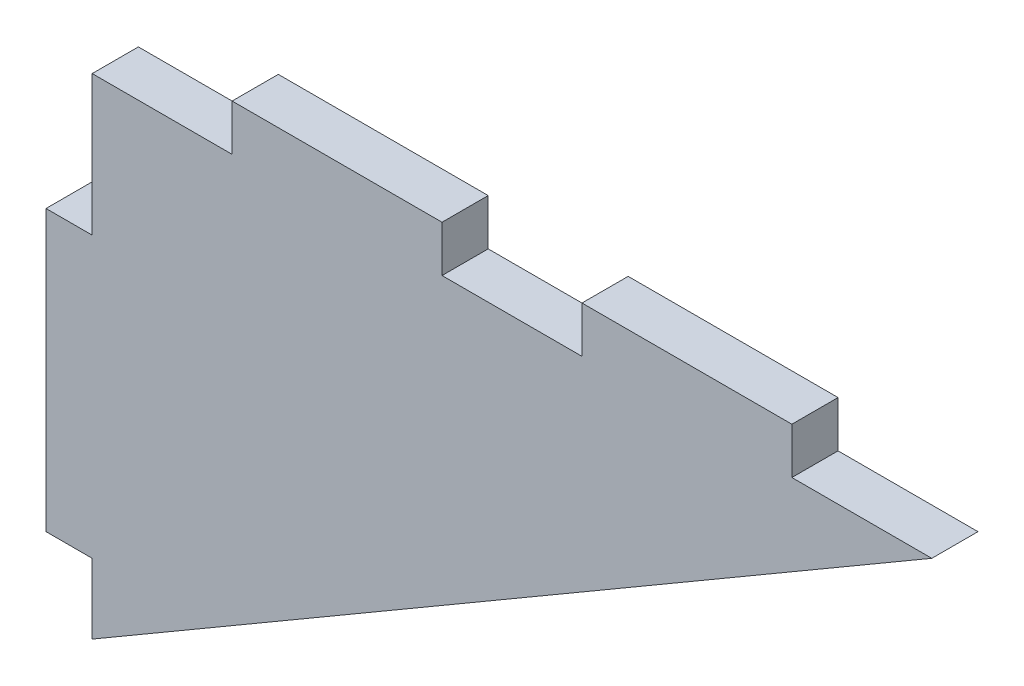
ISO-10303-21;
HEADER;
FILE_DESCRIPTION(('STEP AP214'),'2;1');
FILE_NAME('part.step','',(''),(''),'','','');
FILE_SCHEMA(('AUTOMOTIVE_DESIGN { 1 0 10303 214 1 1 1 1 }'));
ENDSEC;
DATA;
#1=APPLICATION_CONTEXT('core data for automotive mechanical design processes');
#2=APPLICATION_PROTOCOL_DEFINITION('international standard','automotive_design',2000,#1);
#3=PRODUCT_CONTEXT('',#1,'mechanical');
#4=PRODUCT('Part','Part','',(#3));
#5=PRODUCT_RELATED_PRODUCT_CATEGORY('part','',(#4));
#6=PRODUCT_DEFINITION_FORMATION('','',#4);
#7=PRODUCT_DEFINITION_CONTEXT('part definition',#1,'design');
#8=PRODUCT_DEFINITION('design','',#6,#7);
#9=PRODUCT_DEFINITION_SHAPE('','',#8);
#10=(LENGTH_UNIT() NAMED_UNIT(*) SI_UNIT(.MILLI.,.METRE.));
#11=(NAMED_UNIT(*) PLANE_ANGLE_UNIT() SI_UNIT($,.RADIAN.));
#12=(NAMED_UNIT(*) SI_UNIT($,.STERADIAN.) SOLID_ANGLE_UNIT());
#13=UNCERTAINTY_MEASURE_WITH_UNIT(LENGTH_MEASURE(1.E-05),#10,'distance_accuracy_value','');
#14=(GEOMETRIC_REPRESENTATION_CONTEXT(3) GLOBAL_UNCERTAINTY_ASSIGNED_CONTEXT((#13)) GLOBAL_UNIT_ASSIGNED_CONTEXT((#10,
#11,#12)) REPRESENTATION_CONTEXT('',''));
#15=CARTESIAN_POINT('',(0.,0.,0.));
#16=DIRECTION('',(0.,0.,1.));
#17=DIRECTION('',(1.,0.,0.));
#18=AXIS2_PLACEMENT_3D('',#15,#16,#17);
#19=CARTESIAN_POINT('',(-30.,17.5,3.3));
#20=DIRECTION('',(0.,-1.,0.));
#21=DIRECTION('',(0.,0.,-1.));
#22=AXIS2_PLACEMENT_3D('',#19,#20,#21);
#23=PLANE('',#22);
#24=DIRECTION('',(-1.,0.,0.));
#25=VECTOR('',#24,1.);
#26=CARTESIAN_POINT('',(-30.,17.5,0.));
#27=LINE('',#26,#25);
#28=CARTESIAN_POINT('',(-20.,17.5,0.));
#29=VERTEX_POINT('',#28);
#30=CARTESIAN_POINT('',(-30.,17.5,0.));
#31=VERTEX_POINT('',#30);
#32=EDGE_CURVE('E182',#29,#31,#27,.T.);
#33=ORIENTED_EDGE('',*,*,#32,.T.);
#34=DIRECTION('',(0.,0.,-1.));
#35=VECTOR('',#34,1.);
#36=CARTESIAN_POINT('',(-30.,17.5,3.3));
#37=LINE('',#36,#35);
#38=CARTESIAN_POINT('',(-30.,17.5,3.3));
#39=VERTEX_POINT('',#38);
#40=EDGE_CURVE('E11',#39,#31,#37,.T.);
#41=ORIENTED_EDGE('',*,*,#40,.F.);
#42=DIRECTION('',(-1.,0.,0.));
#43=VECTOR('',#42,1.);
#44=CARTESIAN_POINT('',(-30.,17.5,3.3));
#45=LINE('',#44,#43);
#46=CARTESIAN_POINT('',(-20.,17.5,3.3));
#47=VERTEX_POINT('',#46);
#48=EDGE_CURVE('E225',#47,#39,#45,.T.);
#49=ORIENTED_EDGE('',*,*,#48,.F.);
#50=DIRECTION('',(0.,0.,-1.));
#51=VECTOR('',#50,1.);
#52=CARTESIAN_POINT('',(-20.,17.5,3.3));
#53=LINE('',#52,#51);
#54=EDGE_CURVE('E178',#47,#29,#53,.T.);
#55=ORIENTED_EDGE('',*,*,#54,.T.);
#56=EDGE_LOOP('',(#33,#41,#49,#55));
#57=FACE_BOUND('',#56,.T.);
#58=ADVANCED_FACE('F39',(#57),#23,.F.);
#59=CARTESIAN_POINT('',(-30.,7.5,3.3));
#60=DIRECTION('',(1.,0.,0.));
#61=DIRECTION('',(0.,0.,-1.));
#62=AXIS2_PLACEMENT_3D('',#59,#60,#61);
#63=PLANE('',#62);
#64=DIRECTION('',(0.,-1.,0.));
#65=VECTOR('',#64,1.);
#66=CARTESIAN_POINT('',(-30.,7.5,0.));
#67=LINE('',#66,#65);
#68=CARTESIAN_POINT('',(-30.,7.5,0.));
#69=VERTEX_POINT('',#68);
#70=EDGE_CURVE('E186',#31,#69,#67,.T.);
#71=ORIENTED_EDGE('',*,*,#70,.T.);
#72=DIRECTION('',(0.,0.,-1.));
#73=VECTOR('',#72,1.);
#74=CARTESIAN_POINT('',(-30.,7.5,3.3));
#75=LINE('',#74,#73);
#76=CARTESIAN_POINT('',(-30.,7.5,3.3));
#77=VERTEX_POINT('',#76);
#78=EDGE_CURVE('E48',#77,#69,#75,.T.);
#79=ORIENTED_EDGE('',*,*,#78,.F.);
#80=DIRECTION('',(0.,-1.,0.));
#81=VECTOR('',#80,1.);
#82=CARTESIAN_POINT('',(-30.,7.5,3.3));
#83=LINE('',#82,#81);
#84=EDGE_CURVE('E120',#39,#77,#83,.T.);
#85=ORIENTED_EDGE('',*,*,#84,.F.);
#86=ORIENTED_EDGE('',*,*,#40,.T.);
#87=EDGE_LOOP('',(#71,#79,#85,#86));
#88=FACE_BOUND('',#87,.T.);
#89=ADVANCED_FACE('F340',(#88),#63,.F.);
#90=CARTESIAN_POINT('',(-33.3,7.5,3.3));
#91=DIRECTION('',(0.,-1.,0.));
#92=DIRECTION('',(0.,0.,-1.));
#93=AXIS2_PLACEMENT_3D('',#90,#91,#92);
#94=PLANE('',#93);
#95=DIRECTION('',(-1.,0.,0.));
#96=VECTOR('',#95,1.);
#97=CARTESIAN_POINT('',(-33.3,7.5,0.));
#98=LINE('',#97,#96);
#99=CARTESIAN_POINT('',(-33.3,7.5,0.));
#100=VERTEX_POINT('',#99);
#101=EDGE_CURVE('E189',#69,#100,#98,.T.);
#102=ORIENTED_EDGE('',*,*,#101,.T.);
#103=DIRECTION('',(0.,0.,-1.));
#104=VECTOR('',#103,1.);
#105=CARTESIAN_POINT('',(-33.3,7.5,3.3));
#106=LINE('',#105,#104);
#107=CARTESIAN_POINT('',(-33.3,7.5,3.3));
#108=VERTEX_POINT('',#107);
#109=EDGE_CURVE('E264',#108,#100,#106,.T.);
#110=ORIENTED_EDGE('',*,*,#109,.F.);
#111=DIRECTION('',(-1.,0.,0.));
#112=VECTOR('',#111,1.);
#113=CARTESIAN_POINT('',(-33.3,7.5,3.3));
#114=LINE('',#113,#112);
#115=EDGE_CURVE('E274',#77,#108,#114,.T.);
#116=ORIENTED_EDGE('',*,*,#115,.F.);
#117=ORIENTED_EDGE('',*,*,#78,.T.);
#118=EDGE_LOOP('',(#102,#110,#116,#117));
#119=FACE_BOUND('',#118,.T.);
#120=ADVANCED_FACE('F272',(#119),#94,.F.);
#121=CARTESIAN_POINT('',(-33.3,-12.5,3.3));
#122=DIRECTION('',(1.,0.,0.));
#123=DIRECTION('',(0.,0.,-1.));
#124=AXIS2_PLACEMENT_3D('',#121,#122,#123);
#125=PLANE('',#124);
#126=DIRECTION('',(0.,-1.,0.));
#127=VECTOR('',#126,1.);
#128=CARTESIAN_POINT('',(-33.3,-12.5,0.));
#129=LINE('',#128,#127);
#130=CARTESIAN_POINT('',(-33.3,-12.5,0.));
#131=VERTEX_POINT('',#130);
#132=EDGE_CURVE('E192',#100,#131,#129,.T.);
#133=ORIENTED_EDGE('',*,*,#132,.T.);
#134=DIRECTION('',(0.,0.,-1.));
#135=VECTOR('',#134,1.);
#136=CARTESIAN_POINT('',(-33.3,-12.5,3.3));
#137=LINE('',#136,#135);
#138=CARTESIAN_POINT('',(-33.3,-12.5,3.3));
#139=VERTEX_POINT('',#138);
#140=EDGE_CURVE('E260',#139,#131,#137,.T.);
#141=ORIENTED_EDGE('',*,*,#140,.F.);
#142=DIRECTION('',(0.,-1.,0.));
#143=VECTOR('',#142,1.);
#144=CARTESIAN_POINT('',(-33.3,-12.5,3.3));
#145=LINE('',#144,#143);
#146=EDGE_CURVE('E293',#108,#139,#145,.T.);
#147=ORIENTED_EDGE('',*,*,#146,.F.);
#148=ORIENTED_EDGE('',*,*,#109,.T.);
#149=EDGE_LOOP('',(#133,#141,#147,#148));
#150=FACE_BOUND('',#149,.T.);
#151=ADVANCED_FACE('F283',(#150),#125,.F.);
#152=CARTESIAN_POINT('',(-30.,-12.5,3.3));
#153=DIRECTION('',(0.,1.,0.));
#154=DIRECTION('',(0.,0.,1.));
#155=AXIS2_PLACEMENT_3D('',#152,#153,#154);
#156=PLANE('',#155);
#157=DIRECTION('',(1.,0.,0.));
#158=VECTOR('',#157,1.);
#159=CARTESIAN_POINT('',(-30.,-12.5,0.));
#160=LINE('',#159,#158);
#161=CARTESIAN_POINT('',(-30.,-12.5,0.));
#162=VERTEX_POINT('',#161);
#163=EDGE_CURVE('E195',#131,#162,#160,.T.);
#164=ORIENTED_EDGE('',*,*,#163,.T.);
#165=DIRECTION('',(0.,0.,-1.));
#166=VECTOR('',#165,1.);
#167=CARTESIAN_POINT('',(-30.,-12.5,3.3));
#168=LINE('',#167,#166);
#169=CARTESIAN_POINT('',(-30.,-12.5,3.3));
#170=VERTEX_POINT('',#169);
#171=EDGE_CURVE('E256',#170,#162,#168,.T.);
#172=ORIENTED_EDGE('',*,*,#171,.F.);
#173=DIRECTION('',(1.,0.,0.));
#174=VECTOR('',#173,1.);
#175=CARTESIAN_POINT('',(-30.,-12.5,3.3));
#176=LINE('',#175,#174);
#177=EDGE_CURVE('E289',#139,#170,#176,.T.);
#178=ORIENTED_EDGE('',*,*,#177,.F.);
#179=ORIENTED_EDGE('',*,*,#140,.T.);
#180=EDGE_LOOP('',(#164,#172,#178,#179));
#181=FACE_BOUND('',#180,.T.);
#182=ADVANCED_FACE('F287',(#181),#156,.F.);
#183=CARTESIAN_POINT('',(-30.,-12.5,3.3));
#184=DIRECTION('',(1.,0.,0.));
#185=DIRECTION('',(0.,0.,-1.));
#186=AXIS2_PLACEMENT_3D('',#183,#184,#185);
#187=PLANE('',#186);
#188=DIRECTION('',(0.,-1.,0.));
#189=VECTOR('',#188,1.);
#190=CARTESIAN_POINT('',(-30.,-12.5,0.));
#191=LINE('',#190,#189);
#192=CARTESIAN_POINT('',(-30.,-17.5,0.));
#193=VERTEX_POINT('',#192);
#194=EDGE_CURVE('E198',#162,#193,#191,.T.);
#195=ORIENTED_EDGE('',*,*,#194,.T.);
#196=DIRECTION('',(0.,0.,-1.));
#197=VECTOR('',#196,1.);
#198=CARTESIAN_POINT('',(-30.,-17.5,3.3));
#199=LINE('',#198,#197);
#200=CARTESIAN_POINT('',(-30.,-17.5,3.3));
#201=VERTEX_POINT('',#200);
#202=EDGE_CURVE('E252',#201,#193,#199,.T.);
#203=ORIENTED_EDGE('',*,*,#202,.F.);
#204=DIRECTION('',(0.,-1.,0.));
#205=VECTOR('',#204,1.);
#206=CARTESIAN_POINT('',(-30.,-12.5,3.3));
#207=LINE('',#206,#205);
#208=EDGE_CURVE('E292',#170,#201,#207,.T.);
#209=ORIENTED_EDGE('',*,*,#208,.F.);
#210=ORIENTED_EDGE('',*,*,#171,.T.);
#211=EDGE_LOOP('',(#195,#203,#209,#210));
#212=FACE_BOUND('',#211,.T.);
#213=ADVANCED_FACE('F353',(#212),#187,.F.);
#214=CARTESIAN_POINT('',(-30.,-17.5,3.3));
#215=DIRECTION('',(-0.503871025524086,0.863778900898434,0.));
#216=DIRECTION('',(-0.863778900898433,-0.503871025524086,0.));
#217=AXIS2_PLACEMENT_3D('',#214,#215,#216);
#218=PLANE('',#217);
#219=DIRECTION('',(0.863778900898433,0.503871025524086,0.));
#220=VECTOR('',#219,1.);
#221=CARTESIAN_POINT('',(-30.,-17.5,0.));
#222=LINE('',#221,#220);
#223=CARTESIAN_POINT('',(30.,17.5,0.));
#224=VERTEX_POINT('',#223);
#225=EDGE_CURVE('E201',#193,#224,#222,.T.);
#226=ORIENTED_EDGE('',*,*,#225,.T.);
#227=DIRECTION('',(0.,0.,-1.));
#228=VECTOR('',#227,1.);
#229=CARTESIAN_POINT('',(30.,17.5,3.3));
#230=LINE('',#229,#228);
#231=CARTESIAN_POINT('',(30.,17.5,3.3));
#232=VERTEX_POINT('',#231);
#233=EDGE_CURVE('E248',#232,#224,#230,.T.);
#234=ORIENTED_EDGE('',*,*,#233,.F.);
#235=DIRECTION('',(0.863778900898433,0.503871025524086,0.));
#236=VECTOR('',#235,1.);
#237=CARTESIAN_POINT('',(-30.,-17.5,3.3));
#238=LINE('',#237,#236);
#239=EDGE_CURVE('E297',#201,#232,#238,.T.);
#240=ORIENTED_EDGE('',*,*,#239,.F.);
#241=ORIENTED_EDGE('',*,*,#202,.T.);
#242=EDGE_LOOP('',(#226,#234,#240,#241));
#243=FACE_BOUND('',#242,.T.);
#244=ADVANCED_FACE('F356',(#243),#218,.F.);
#245=CARTESIAN_POINT('',(20.,17.5,3.3));
#246=DIRECTION('',(0.,-1.,0.));
#247=DIRECTION('',(0.,0.,-1.));
#248=AXIS2_PLACEMENT_3D('',#245,#246,#247);
#249=PLANE('',#248);
#250=DIRECTION('',(-1.,0.,0.));
#251=VECTOR('',#250,1.);
#252=CARTESIAN_POINT('',(20.,17.5,0.));
#253=LINE('',#252,#251);
#254=CARTESIAN_POINT('',(20.,17.5,0.));
#255=VERTEX_POINT('',#254);
#256=EDGE_CURVE('E204',#224,#255,#253,.T.);
#257=ORIENTED_EDGE('',*,*,#256,.T.);
#258=DIRECTION('',(0.,0.,-1.));
#259=VECTOR('',#258,1.);
#260=CARTESIAN_POINT('',(20.,17.5,3.3));
#261=LINE('',#260,#259);
#262=CARTESIAN_POINT('',(20.,17.5,3.3));
#263=VERTEX_POINT('',#262);
#264=EDGE_CURVE('E244',#263,#255,#261,.T.);
#265=ORIENTED_EDGE('',*,*,#264,.F.);
#266=DIRECTION('',(-1.,0.,0.));
#267=VECTOR('',#266,1.);
#268=CARTESIAN_POINT('',(20.,17.5,3.3));
#269=LINE('',#268,#267);
#270=EDGE_CURVE('E304',#232,#263,#269,.T.);
#271=ORIENTED_EDGE('',*,*,#270,.F.);
#272=ORIENTED_EDGE('',*,*,#233,.T.);
#273=EDGE_LOOP('',(#257,#265,#271,#272));
#274=FACE_BOUND('',#273,.T.);
#275=ADVANCED_FACE('F360',(#274),#249,.F.);
#276=CARTESIAN_POINT('',(20.,20.8,3.3));
#277=DIRECTION('',(-1.,0.,0.));
#278=DIRECTION('',(0.,0.,1.));
#279=AXIS2_PLACEMENT_3D('',#276,#277,#278);
#280=PLANE('',#279);
#281=DIRECTION('',(0.,1.,0.));
#282=VECTOR('',#281,1.);
#283=CARTESIAN_POINT('',(20.,20.8,0.));
#284=LINE('',#283,#282);
#285=CARTESIAN_POINT('',(20.,20.8,0.));
#286=VERTEX_POINT('',#285);
#287=EDGE_CURVE('E207',#255,#286,#284,.T.);
#288=ORIENTED_EDGE('',*,*,#287,.T.);
#289=DIRECTION('',(0.,0.,-1.));
#290=VECTOR('',#289,1.);
#291=CARTESIAN_POINT('',(20.,20.8,3.3));
#292=LINE('',#291,#290);
#293=CARTESIAN_POINT('',(20.,20.8,3.3));
#294=VERTEX_POINT('',#293);
#295=EDGE_CURVE('E240',#294,#286,#292,.T.);
#296=ORIENTED_EDGE('',*,*,#295,.F.);
#297=DIRECTION('',(0.,1.,0.));
#298=VECTOR('',#297,1.);
#299=CARTESIAN_POINT('',(20.,20.8,3.3));
#300=LINE('',#299,#298);
#301=EDGE_CURVE('E307',#263,#294,#300,.T.);
#302=ORIENTED_EDGE('',*,*,#301,.F.);
#303=ORIENTED_EDGE('',*,*,#264,.T.);
#304=EDGE_LOOP('',(#288,#296,#302,#303));
#305=FACE_BOUND('',#304,.T.);
#306=ADVANCED_FACE('F364',(#305),#280,.F.);
#307=CARTESIAN_POINT('',(5.,20.8,3.3));
#308=DIRECTION('',(0.,-1.,0.));
#309=DIRECTION('',(0.,0.,-1.));
#310=AXIS2_PLACEMENT_3D('',#307,#308,#309);
#311=PLANE('',#310);
#312=DIRECTION('',(-1.,0.,0.));
#313=VECTOR('',#312,1.);
#314=CARTESIAN_POINT('',(5.,20.8,0.));
#315=LINE('',#314,#313);
#316=CARTESIAN_POINT('',(5.,20.8,0.));
#317=VERTEX_POINT('',#316);
#318=EDGE_CURVE('E210',#286,#317,#315,.T.);
#319=ORIENTED_EDGE('',*,*,#318,.T.);
#320=DIRECTION('',(0.,0.,-1.));
#321=VECTOR('',#320,1.);
#322=CARTESIAN_POINT('',(5.,20.8,3.3));
#323=LINE('',#322,#321);
#324=CARTESIAN_POINT('',(5.,20.8,3.3));
#325=VERTEX_POINT('',#324);
#326=EDGE_CURVE('E236',#325,#317,#323,.T.);
#327=ORIENTED_EDGE('',*,*,#326,.F.);
#328=DIRECTION('',(-1.,0.,0.));
#329=VECTOR('',#328,1.);
#330=CARTESIAN_POINT('',(5.,20.8,3.3));
#331=LINE('',#330,#329);
#332=EDGE_CURVE('E310',#294,#325,#331,.T.);
#333=ORIENTED_EDGE('',*,*,#332,.F.);
#334=ORIENTED_EDGE('',*,*,#295,.T.);
#335=EDGE_LOOP('',(#319,#327,#333,#334));
#336=FACE_BOUND('',#335,.T.);
#337=ADVANCED_FACE('F368',(#336),#311,.F.);
#338=CARTESIAN_POINT('',(5.,17.5,3.3));
#339=DIRECTION('',(1.,0.,0.));
#340=DIRECTION('',(0.,0.,-1.));
#341=AXIS2_PLACEMENT_3D('',#338,#339,#340);
#342=PLANE('',#341);
#343=DIRECTION('',(0.,-1.,0.));
#344=VECTOR('',#343,1.);
#345=CARTESIAN_POINT('',(5.,17.5,0.));
#346=LINE('',#345,#344);
#347=CARTESIAN_POINT('',(5.,17.5,0.));
#348=VERTEX_POINT('',#347);
#349=EDGE_CURVE('E213',#317,#348,#346,.T.);
#350=ORIENTED_EDGE('',*,*,#349,.T.);
#351=DIRECTION('',(0.,0.,-1.));
#352=VECTOR('',#351,1.);
#353=CARTESIAN_POINT('',(5.,17.5,3.3));
#354=LINE('',#353,#352);
#355=CARTESIAN_POINT('',(5.,17.5,3.3));
#356=VERTEX_POINT('',#355);
#357=EDGE_CURVE('E232',#356,#348,#354,.T.);
#358=ORIENTED_EDGE('',*,*,#357,.F.);
#359=DIRECTION('',(0.,-1.,0.));
#360=VECTOR('',#359,1.);
#361=CARTESIAN_POINT('',(5.,17.5,3.3));
#362=LINE('',#361,#360);
#363=EDGE_CURVE('E313',#325,#356,#362,.T.);
#364=ORIENTED_EDGE('',*,*,#363,.F.);
#365=ORIENTED_EDGE('',*,*,#326,.T.);
#366=EDGE_LOOP('',(#350,#358,#364,#365));
#367=FACE_BOUND('',#366,.T.);
#368=ADVANCED_FACE('F321',(#367),#342,.F.);
#369=CARTESIAN_POINT('',(-5.,17.5,3.3));
#370=DIRECTION('',(0.,-1.,0.));
#371=DIRECTION('',(0.,0.,-1.));
#372=AXIS2_PLACEMENT_3D('',#369,#370,#371);
#373=PLANE('',#372);
#374=DIRECTION('',(-1.,0.,0.));
#375=VECTOR('',#374,1.);
#376=CARTESIAN_POINT('',(-5.,17.5,0.));
#377=LINE('',#376,#375);
#378=CARTESIAN_POINT('',(-5.,17.5,0.));
#379=VERTEX_POINT('',#378);
#380=EDGE_CURVE('E216',#348,#379,#377,.T.);
#381=ORIENTED_EDGE('',*,*,#380,.T.);
#382=DIRECTION('',(0.,0.,-1.));
#383=VECTOR('',#382,1.);
#384=CARTESIAN_POINT('',(-5.,17.5,3.3));
#385=LINE('',#384,#383);
#386=CARTESIAN_POINT('',(-5.,17.5,3.3));
#387=VERTEX_POINT('',#386);
#388=EDGE_CURVE('E171',#387,#379,#385,.T.);
#389=ORIENTED_EDGE('',*,*,#388,.F.);
#390=DIRECTION('',(-1.,0.,0.));
#391=VECTOR('',#390,1.);
#392=CARTESIAN_POINT('',(-5.,17.5,3.3));
#393=LINE('',#392,#391);
#394=EDGE_CURVE('E160',#356,#387,#393,.T.);
#395=ORIENTED_EDGE('',*,*,#394,.F.);
#396=ORIENTED_EDGE('',*,*,#357,.T.);
#397=EDGE_LOOP('',(#381,#389,#395,#396));
#398=FACE_BOUND('',#397,.T.);
#399=ADVANCED_FACE('F325',(#398),#373,.F.);
#400=CARTESIAN_POINT('',(-5.,20.8,3.3));
#401=DIRECTION('',(-1.,0.,0.));
#402=DIRECTION('',(0.,0.,1.));
#403=AXIS2_PLACEMENT_3D('',#400,#401,#402);
#404=PLANE('',#403);
#405=DIRECTION('',(0.,1.,0.));
#406=VECTOR('',#405,1.);
#407=CARTESIAN_POINT('',(-5.,20.8,0.));
#408=LINE('',#407,#406);
#409=CARTESIAN_POINT('',(-5.,20.8,0.));
#410=VERTEX_POINT('',#409);
#411=EDGE_CURVE('E169',#379,#410,#408,.T.);
#412=ORIENTED_EDGE('',*,*,#411,.T.);
#413=DIRECTION('',(0.,0.,-1.));
#414=VECTOR('',#413,1.);
#415=CARTESIAN_POINT('',(-5.,20.8,3.3));
#416=LINE('',#415,#414);
#417=CARTESIAN_POINT('',(-5.,20.8,3.3));
#418=VERTEX_POINT('',#417);
#419=EDGE_CURVE('E166',#418,#410,#416,.T.);
#420=ORIENTED_EDGE('',*,*,#419,.F.);
#421=DIRECTION('',(0.,1.,0.));
#422=VECTOR('',#421,1.);
#423=CARTESIAN_POINT('',(-5.,20.8,3.3));
#424=LINE('',#423,#422);
#425=EDGE_CURVE('E154',#387,#418,#424,.T.);
#426=ORIENTED_EDGE('',*,*,#425,.F.);
#427=ORIENTED_EDGE('',*,*,#388,.T.);
#428=EDGE_LOOP('',(#412,#420,#426,#427));
#429=FACE_BOUND('',#428,.T.);
#430=ADVANCED_FACE('F167',(#429),#404,.F.);
#431=CARTESIAN_POINT('',(-20.,20.8,3.3));
#432=DIRECTION('',(0.,-1.,0.));
#433=DIRECTION('',(0.,0.,-1.));
#434=AXIS2_PLACEMENT_3D('',#431,#432,#433);
#435=PLANE('',#434);
#436=DIRECTION('',(-1.,0.,0.));
#437=VECTOR('',#436,1.);
#438=CARTESIAN_POINT('',(-20.,20.8,0.));
#439=LINE('',#438,#437);
#440=CARTESIAN_POINT('',(-20.,20.8,0.));
#441=VERTEX_POINT('',#440);
#442=EDGE_CURVE('E106',#410,#441,#439,.T.);
#443=ORIENTED_EDGE('',*,*,#442,.T.);
#444=DIRECTION('',(0.,0.,-1.));
#445=VECTOR('',#444,1.);
#446=CARTESIAN_POINT('',(-20.,20.8,3.3));
#447=LINE('',#446,#445);
#448=CARTESIAN_POINT('',(-20.,20.8,3.3));
#449=VERTEX_POINT('',#448);
#450=EDGE_CURVE('E172',#449,#441,#447,.T.);
#451=ORIENTED_EDGE('',*,*,#450,.F.);
#452=DIRECTION('',(-1.,0.,0.));
#453=VECTOR('',#452,1.);
#454=CARTESIAN_POINT('',(-20.,20.8,3.3));
#455=LINE('',#454,#453);
#456=EDGE_CURVE('E158',#418,#449,#455,.T.);
#457=ORIENTED_EDGE('',*,*,#456,.F.);
#458=ORIENTED_EDGE('',*,*,#419,.T.);
#459=EDGE_LOOP('',(#443,#451,#457,#458));
#460=FACE_BOUND('',#459,.T.);
#461=ADVANCED_FACE('F174',(#460),#435,.F.);
#462=CARTESIAN_POINT('',(-20.,17.5,3.3));
#463=DIRECTION('',(1.,0.,0.));
#464=DIRECTION('',(0.,0.,-1.));
#465=AXIS2_PLACEMENT_3D('',#462,#463,#464);
#466=PLANE('',#465);
#467=DIRECTION('',(0.,-1.,0.));
#468=VECTOR('',#467,1.);
#469=CARTESIAN_POINT('',(-20.,17.5,0.));
#470=LINE('',#469,#468);
#471=EDGE_CURVE('E112',#441,#29,#470,.T.);
#472=ORIENTED_EDGE('',*,*,#471,.T.);
#473=ORIENTED_EDGE('',*,*,#54,.F.);
#474=DIRECTION('',(0.,-1.,0.));
#475=VECTOR('',#474,1.);
#476=CARTESIAN_POINT('',(-20.,17.5,3.3));
#477=LINE('',#476,#475);
#478=EDGE_CURVE('E56',#449,#47,#477,.T.);
#479=ORIENTED_EDGE('',*,*,#478,.F.);
#480=ORIENTED_EDGE('',*,*,#450,.T.);
#481=EDGE_LOOP('',(#472,#473,#479,#480));
#482=FACE_BOUND('',#481,.T.);
#483=ADVANCED_FACE('F329',(#482),#466,.F.);
#484=CARTESIAN_POINT('',(0.,0.,3.3));
#485=DIRECTION('',(0.,0.,1.));
#486=DIRECTION('',(1.,0.,0.));
#487=AXIS2_PLACEMENT_3D('',#484,#485,#486);
#488=PLANE('',#487);
#489=ORIENTED_EDGE('',*,*,#48,.T.);
#490=ORIENTED_EDGE('',*,*,#84,.T.);
#491=ORIENTED_EDGE('',*,*,#115,.T.);
#492=ORIENTED_EDGE('',*,*,#146,.T.);
#493=ORIENTED_EDGE('',*,*,#177,.T.);
#494=ORIENTED_EDGE('',*,*,#208,.T.);
#495=ORIENTED_EDGE('',*,*,#239,.T.);
#496=ORIENTED_EDGE('',*,*,#270,.T.);
#497=ORIENTED_EDGE('',*,*,#301,.T.);
#498=ORIENTED_EDGE('',*,*,#332,.T.);
#499=ORIENTED_EDGE('',*,*,#363,.T.);
#500=ORIENTED_EDGE('',*,*,#394,.T.);
#501=ORIENTED_EDGE('',*,*,#425,.T.);
#502=ORIENTED_EDGE('',*,*,#456,.T.);
#503=ORIENTED_EDGE('',*,*,#478,.T.);
#504=EDGE_LOOP('',(#489,#490,#491,#492,#493,#494,#495,#496,#497,#498,#499,#500,#501,#502,#503));
#505=FACE_BOUND('',#504,.T.);
#506=ADVANCED_FACE('F156',(#505),#488,.T.);
#507=CARTESIAN_POINT('',(0.,0.,0.));
#508=DIRECTION('',(0.,0.,1.));
#509=DIRECTION('',(1.,0.,0.));
#510=AXIS2_PLACEMENT_3D('',#507,#508,#509);
#511=PLANE('',#510);
#512=ORIENTED_EDGE('',*,*,#32,.F.);
#513=ORIENTED_EDGE('',*,*,#471,.F.);
#514=ORIENTED_EDGE('',*,*,#442,.F.);
#515=ORIENTED_EDGE('',*,*,#411,.F.);
#516=ORIENTED_EDGE('',*,*,#380,.F.);
#517=ORIENTED_EDGE('',*,*,#349,.F.);
#518=ORIENTED_EDGE('',*,*,#318,.F.);
#519=ORIENTED_EDGE('',*,*,#287,.F.);
#520=ORIENTED_EDGE('',*,*,#256,.F.);
#521=ORIENTED_EDGE('',*,*,#225,.F.);
#522=ORIENTED_EDGE('',*,*,#194,.F.);
#523=ORIENTED_EDGE('',*,*,#163,.F.);
#524=ORIENTED_EDGE('',*,*,#132,.F.);
#525=ORIENTED_EDGE('',*,*,#101,.F.);
#526=ORIENTED_EDGE('',*,*,#70,.F.);
#527=EDGE_LOOP('',(#512,#513,#514,#515,#516,#517,#518,#519,#520,#521,#522,#523,#524,#525,#526));
#528=FACE_BOUND('',#527,.T.);
#529=ADVANCED_FACE('F278',(#528),#511,.F.);
#530=CLOSED_SHELL('',(#58,#89,#120,#151,#182,#213,#244,#275,#306,#337,#368,#399,#430,#461,#483,
#506,#529));
#531=MANIFOLD_SOLID_BREP('B2',#530);
#532=ADVANCED_BREP_SHAPE_REPRESENTATION('',(#18,#531),#14);
#533=SHAPE_DEFINITION_REPRESENTATION(#9,#532);
ENDSEC;
END-ISO-10303-21;
